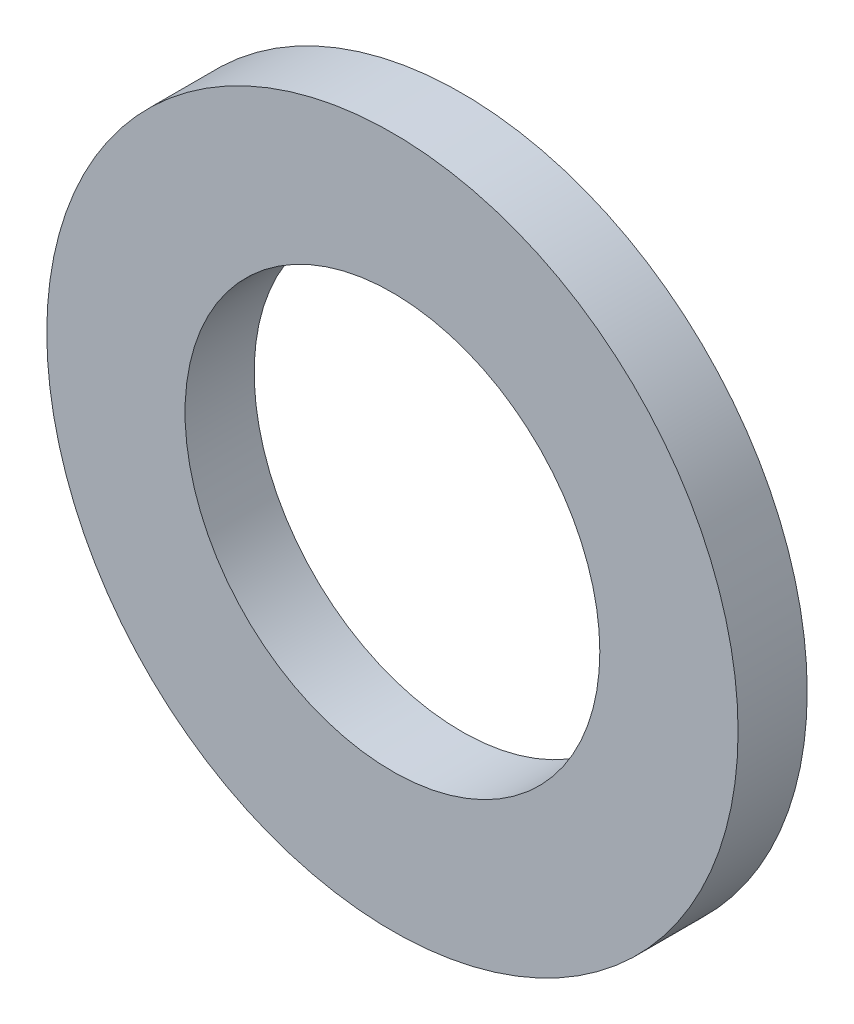
ISO-10303-21;
HEADER;
FILE_DESCRIPTION(('STEP AP214'),'2;1');
FILE_NAME('part.step','',(''),(''),'','','');
FILE_SCHEMA(('AUTOMOTIVE_DESIGN { 1 0 10303 214 1 1 1 1 }'));
ENDSEC;
DATA;
#1=APPLICATION_CONTEXT('core data for automotive mechanical design processes');
#2=APPLICATION_PROTOCOL_DEFINITION('international standard','automotive_design',2000,#1);
#3=PRODUCT_CONTEXT('',#1,'mechanical');
#4=PRODUCT('Part','Part','',(#3));
#5=PRODUCT_RELATED_PRODUCT_CATEGORY('part','',(#4));
#6=PRODUCT_DEFINITION_FORMATION('','',#4);
#7=PRODUCT_DEFINITION_CONTEXT('part definition',#1,'design');
#8=PRODUCT_DEFINITION('design','',#6,#7);
#9=PRODUCT_DEFINITION_SHAPE('','',#8);
#10=(LENGTH_UNIT() NAMED_UNIT(*) SI_UNIT(.MILLI.,.METRE.));
#11=(NAMED_UNIT(*) PLANE_ANGLE_UNIT() SI_UNIT($,.RADIAN.));
#12=(NAMED_UNIT(*) SI_UNIT($,.STERADIAN.) SOLID_ANGLE_UNIT());
#13=UNCERTAINTY_MEASURE_WITH_UNIT(LENGTH_MEASURE(1.E-05),#10,'distance_accuracy_value','');
#14=(GEOMETRIC_REPRESENTATION_CONTEXT(3) GLOBAL_UNCERTAINTY_ASSIGNED_CONTEXT((#13)) GLOBAL_UNIT_ASSIGNED_CONTEXT((#10,
#11,#12)) REPRESENTATION_CONTEXT('',''));
#15=CARTESIAN_POINT('',(0.,0.,0.));
#16=DIRECTION('',(0.,0.,1.));
#17=DIRECTION('',(1.,0.,0.));
#18=AXIS2_PLACEMENT_3D('',#15,#16,#17);
#19=CARTESIAN_POINT('',(0.,0.,5.08));
#20=DIRECTION('',(0.,0.,1.));
#21=DIRECTION('',(1.,0.,0.));
#22=AXIS2_PLACEMENT_3D('',#19,#20,#21);
#23=PLANE('',#22);
#24=CARTESIAN_POINT('',(0.,0.,5.08));
#25=DIRECTION('',(0.,0.,1.));
#26=DIRECTION('',(1.,0.,0.));
#27=AXIS2_PLACEMENT_3D('',#24,#25,#26);
#28=CIRCLE('',#27,25.4);
#29=CARTESIAN_POINT('',(25.4,0.,5.08));
#30=VERTEX_POINT('',#29);
#31=EDGE_CURVE('E11',#30,#30,#28,.T.);
#32=ORIENTED_EDGE('',*,*,#31,.T.);
#33=EDGE_LOOP('',(#32));
#34=FACE_BOUND('',#33,.T.);
#35=CARTESIAN_POINT('',(0.,0.,5.08));
#36=DIRECTION('',(0.,0.,1.));
#37=DIRECTION('',(1.,0.,0.));
#38=AXIS2_PLACEMENT_3D('',#35,#36,#37);
#39=CIRCLE('',#38,15.24);
#40=CARTESIAN_POINT('',(15.24,0.,5.08));
#41=VERTEX_POINT('',#40);
#42=EDGE_CURVE('E57',#41,#41,#39,.T.);
#43=ORIENTED_EDGE('',*,*,#42,.F.);
#44=EDGE_LOOP('',(#43));
#45=FACE_BOUND('',#44,.T.);
#46=ADVANCED_FACE('F44',(#34,#45),#23,.T.);
#47=CARTESIAN_POINT('',(0.,0.,0.));
#48=DIRECTION('',(0.,0.,1.));
#49=DIRECTION('',(1.,0.,0.));
#50=AXIS2_PLACEMENT_3D('',#47,#48,#49);
#51=PLANE('',#50);
#52=CARTESIAN_POINT('',(0.,0.,0.));
#53=DIRECTION('',(0.,0.,1.));
#54=DIRECTION('',(1.,0.,0.));
#55=AXIS2_PLACEMENT_3D('',#52,#53,#54);
#56=CIRCLE('',#55,25.4);
#57=CARTESIAN_POINT('',(25.4,0.,0.));
#58=VERTEX_POINT('',#57);
#59=EDGE_CURVE('E48',#58,#58,#56,.T.);
#60=ORIENTED_EDGE('',*,*,#59,.F.);
#61=EDGE_LOOP('',(#60));
#62=FACE_BOUND('',#61,.T.);
#63=CARTESIAN_POINT('',(0.,0.,0.));
#64=DIRECTION('',(0.,0.,1.));
#65=DIRECTION('',(1.,0.,0.));
#66=AXIS2_PLACEMENT_3D('',#63,#64,#65);
#67=CIRCLE('',#66,15.24);
#68=CARTESIAN_POINT('',(15.24,0.,0.));
#69=VERTEX_POINT('',#68);
#70=EDGE_CURVE('E60',#69,#69,#67,.T.);
#71=ORIENTED_EDGE('',*,*,#70,.T.);
#72=EDGE_LOOP('',(#71));
#73=FACE_BOUND('',#72,.T.);
#74=ADVANCED_FACE('F72',(#62,#73),#51,.F.);
#75=CARTESIAN_POINT('',(0.,0.,5.08));
#76=DIRECTION('',(0.,0.,-1.));
#77=DIRECTION('',(-1.,0.,0.));
#78=AXIS2_PLACEMENT_3D('',#75,#76,#77);
#79=CYLINDRICAL_SURFACE('',#78,25.4);
#80=ORIENTED_EDGE('',*,*,#31,.F.);
#81=EDGE_LOOP('',(#80));
#82=FACE_BOUND('',#81,.T.);
#83=ORIENTED_EDGE('',*,*,#59,.T.);
#84=EDGE_LOOP('',(#83));
#85=FACE_BOUND('',#84,.T.);
#86=ADVANCED_FACE('F46',(#82,#85),#79,.T.);
#87=CARTESIAN_POINT('',(0.,0.,5.08));
#88=DIRECTION('',(0.,0.,-1.));
#89=DIRECTION('',(-1.,0.,0.));
#90=AXIS2_PLACEMENT_3D('',#87,#88,#89);
#91=CYLINDRICAL_SURFACE('',#90,15.24);
#92=ORIENTED_EDGE('',*,*,#42,.T.);
#93=EDGE_LOOP('',(#92));
#94=FACE_BOUND('',#93,.T.);
#95=ORIENTED_EDGE('',*,*,#70,.F.);
#96=EDGE_LOOP('',(#95));
#97=FACE_BOUND('',#96,.T.);
#98=ADVANCED_FACE('F68',(#94,#97),#91,.F.);
#99=CLOSED_SHELL('',(#46,#74,#86,#98));
#100=MANIFOLD_SOLID_BREP('B2',#99);
#101=ADVANCED_BREP_SHAPE_REPRESENTATION('',(#18,#100),#14);
#102=SHAPE_DEFINITION_REPRESENTATION(#9,#101);
ENDSEC;
END-ISO-10303-21;
